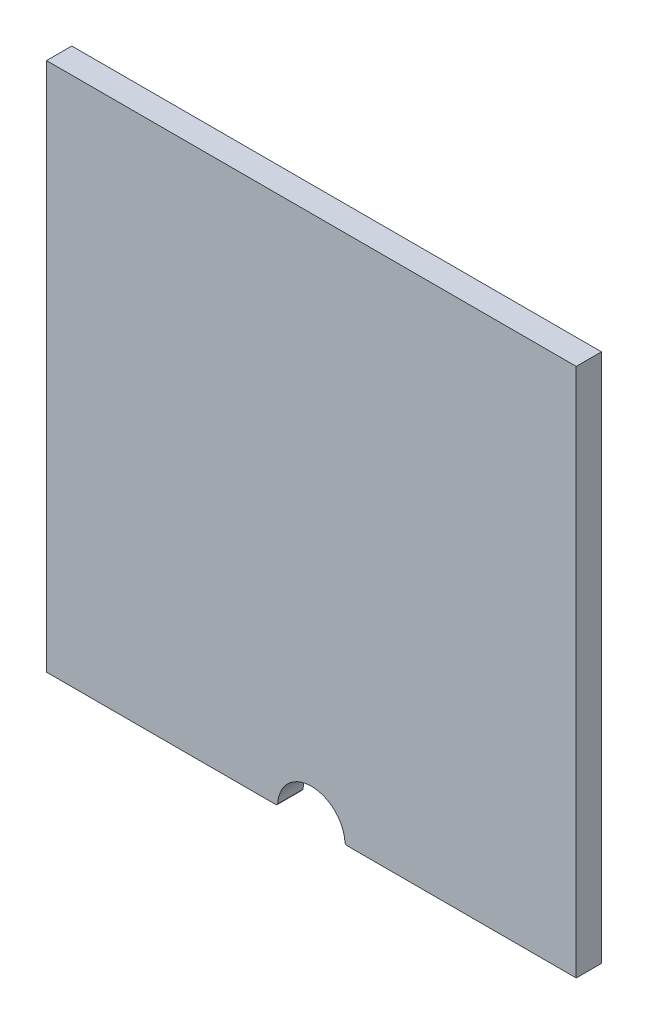
ISO-10303-21;
HEADER;
FILE_DESCRIPTION(('STEP AP214'),'2;1');
FILE_NAME('part.step','',(''),(''),'','','');
FILE_SCHEMA(('AUTOMOTIVE_DESIGN { 1 0 10303 214 1 1 1 1 }'));
ENDSEC;
DATA;
#1=APPLICATION_CONTEXT('core data for automotive mechanical design processes');
#2=APPLICATION_PROTOCOL_DEFINITION('international standard','automotive_design',2000,#1);
#3=PRODUCT_CONTEXT('',#1,'mechanical');
#4=PRODUCT('Part','Part','',(#3));
#5=PRODUCT_RELATED_PRODUCT_CATEGORY('part','',(#4));
#6=PRODUCT_DEFINITION_FORMATION('','',#4);
#7=PRODUCT_DEFINITION_CONTEXT('part definition',#1,'design');
#8=PRODUCT_DEFINITION('design','',#6,#7);
#9=PRODUCT_DEFINITION_SHAPE('','',#8);
#10=(LENGTH_UNIT() NAMED_UNIT(*) SI_UNIT(.MILLI.,.METRE.));
#11=(NAMED_UNIT(*) PLANE_ANGLE_UNIT() SI_UNIT($,.RADIAN.));
#12=(NAMED_UNIT(*) SI_UNIT($,.STERADIAN.) SOLID_ANGLE_UNIT());
#13=UNCERTAINTY_MEASURE_WITH_UNIT(LENGTH_MEASURE(1.E-05),#10,'distance_accuracy_value','');
#14=(GEOMETRIC_REPRESENTATION_CONTEXT(3) GLOBAL_UNCERTAINTY_ASSIGNED_CONTEXT((#13)) GLOBAL_UNIT_ASSIGNED_CONTEXT((#10,
#11,#12)) REPRESENTATION_CONTEXT('',''));
#15=CARTESIAN_POINT('',(0.,0.,0.));
#16=DIRECTION('',(0.,0.,1.));
#17=DIRECTION('',(1.,0.,0.));
#18=AXIS2_PLACEMENT_3D('',#15,#16,#17);
#19=CARTESIAN_POINT('',(0.0508,0.0508,0.));
#20=DIRECTION('',(0.,-1.,0.));
#21=DIRECTION('',(0.,0.,-1.));
#22=AXIS2_PLACEMENT_3D('',#19,#20,#21);
#23=PLANE('',#22);
#24=DIRECTION('',(1.,0.,0.));
#25=VECTOR('',#24,1.);
#26=CARTESIAN_POINT('',(0.0508,0.0508,9.525));
#27=LINE('',#26,#25);
#28=CARTESIAN_POINT('',(113.470384181604,0.0508,9.525));
#29=VERTEX_POINT('',#28);
#30=CARTESIAN_POINT('',(199.9492,0.0508,9.525));
#31=VERTEX_POINT('',#30);
#32=EDGE_CURVE('E146',#29,#31,#27,.T.);
#33=ORIENTED_EDGE('',*,*,#32,.F.);
#34=DIRECTION('',(0.,0.,-1.));
#35=VECTOR('',#34,1.);
#36=CARTESIAN_POINT('',(113.470384181604,0.0508,0.));
#37=LINE('',#36,#35);
#38=CARTESIAN_POINT('',(113.470384181604,0.0508,0.));
#39=VERTEX_POINT('',#38);
#40=EDGE_CURVE('E11',#29,#39,#37,.T.);
#41=ORIENTED_EDGE('',*,*,#40,.T.);
#42=DIRECTION('',(1.,0.,0.));
#43=VECTOR('',#42,1.);
#44=CARTESIAN_POINT('',(0.0508,0.0508,0.));
#45=LINE('',#44,#43);
#46=CARTESIAN_POINT('',(199.9492,0.0508,0.));
#47=VERTEX_POINT('',#46);
#48=EDGE_CURVE('E155',#39,#47,#45,.T.);
#49=ORIENTED_EDGE('',*,*,#48,.T.);
#50=DIRECTION('',(0.,0.,1.));
#51=VECTOR('',#50,1.);
#52=CARTESIAN_POINT('',(199.9492,0.0508,0.));
#53=LINE('',#52,#51);
#54=EDGE_CURVE('E134',#47,#31,#53,.T.);
#55=ORIENTED_EDGE('',*,*,#54,.T.);
#56=EDGE_LOOP('',(#33,#41,#49,#55));
#57=FACE_BOUND('',#56,.T.);
#58=ADVANCED_FACE('F39',(#57),#23,.T.);
#59=CARTESIAN_POINT('',(0.,0.,0.));
#60=DIRECTION('',(0.,0.,-1.));
#61=DIRECTION('',(-1.,0.,0.));
#62=AXIS2_PLACEMENT_3D('',#59,#60,#61);
#63=PLANE('',#62);
#64=CARTESIAN_POINT('',(100.,0.0508000000000002,0.));
#65=DIRECTION('',(0.,0.,1.));
#66=DIRECTION('',(1.,0.,0.));
#67=AXIS2_PLACEMENT_3D('',#64,#65,#66);
#68=CIRCLE('',#67,12.7);
#69=CARTESIAN_POINT('',(112.678008641509,0.797858823529412,0.));
#70=VERTEX_POINT('',#69);
#71=CARTESIAN_POINT('',(87.3219913584906,0.797858823529412,0.));
#72=VERTEX_POINT('',#71);
#73=EDGE_CURVE('E180',#70,#72,#68,.T.);
#74=ORIENTED_EDGE('',*,*,#73,.T.);
#75=CARTESIAN_POINT('',(86.5296158183963,0.84455,0.));
#76=DIRECTION('',(0.,0.,-1.));
#77=DIRECTION('',(-1.,0.,0.));
#78=AXIS2_PLACEMENT_3D('',#75,#76,#77);
#79=CIRCLE('',#78,0.79375);
#80=CARTESIAN_POINT('',(86.5296158183963,0.0508,0.));
#81=VERTEX_POINT('',#80);
#82=EDGE_CURVE('E48',#72,#81,#79,.T.);
#83=ORIENTED_EDGE('',*,*,#82,.T.);
#84=CARTESIAN_POINT('',(0.0508,0.0508,0.));
#85=VERTEX_POINT('',#84);
#86=EDGE_CURVE('E132',#85,#81,#45,.T.);
#87=ORIENTED_EDGE('',*,*,#86,.F.);
#88=DIRECTION('',(0.,-1.,0.));
#89=VECTOR('',#88,1.);
#90=CARTESIAN_POINT('',(0.0508,199.9492,0.));
#91=LINE('',#90,#89);
#92=CARTESIAN_POINT('',(0.0508,199.9492,0.));
#93=VERTEX_POINT('',#92);
#94=EDGE_CURVE('E110',#93,#85,#91,.T.);
#95=ORIENTED_EDGE('',*,*,#94,.F.);
#96=DIRECTION('',(-1.,0.,0.));
#97=VECTOR('',#96,1.);
#98=CARTESIAN_POINT('',(199.9492,199.9492,0.));
#99=LINE('',#98,#97);
#100=CARTESIAN_POINT('',(199.9492,199.9492,0.));
#101=VERTEX_POINT('',#100);
#102=EDGE_CURVE('E121',#101,#93,#99,.T.);
#103=ORIENTED_EDGE('',*,*,#102,.F.);
#104=DIRECTION('',(0.,1.,0.));
#105=VECTOR('',#104,1.);
#106=CARTESIAN_POINT('',(199.9492,0.0508,0.));
#107=LINE('',#106,#105);
#108=EDGE_CURVE('E128',#47,#101,#107,.T.);
#109=ORIENTED_EDGE('',*,*,#108,.F.);
#110=ORIENTED_EDGE('',*,*,#48,.F.);
#111=CARTESIAN_POINT('',(113.470384181604,0.84455,0.));
#112=DIRECTION('',(0.,0.,-1.));
#113=DIRECTION('',(-1.,0.,0.));
#114=AXIS2_PLACEMENT_3D('',#111,#112,#113);
#115=CIRCLE('',#114,0.79375);
#116=EDGE_CURVE('E176',#39,#70,#115,.T.);
#117=ORIENTED_EDGE('',*,*,#116,.T.);
#118=EDGE_LOOP('',(#74,#83,#87,#95,#103,#109,#110,#117));
#119=FACE_BOUND('',#118,.T.);
#120=ADVANCED_FACE('F130',(#119),#63,.T.);
#121=ORIENTED_EDGE('',*,*,#86,.T.);
#122=DIRECTION('',(0.,0.,-1.));
#123=VECTOR('',#122,1.);
#124=CARTESIAN_POINT('',(86.5296158183963,0.0508,9.525));
#125=LINE('',#124,#123);
#126=CARTESIAN_POINT('',(86.5296158183963,0.0508,9.525));
#127=VERTEX_POINT('',#126);
#128=EDGE_CURVE('E157',#81,#127,#125,.F.);
#129=ORIENTED_EDGE('',*,*,#128,.T.);
#130=CARTESIAN_POINT('',(0.0508,0.0508,9.525));
#131=VERTEX_POINT('',#130);
#132=EDGE_CURVE('E141',#131,#127,#27,.T.);
#133=ORIENTED_EDGE('',*,*,#132,.F.);
#134=DIRECTION('',(0.,0.,1.));
#135=VECTOR('',#134,1.);
#136=CARTESIAN_POINT('',(0.0508,0.0508,0.));
#137=LINE('',#136,#135);
#138=EDGE_CURVE('E117',#85,#131,#137,.T.);
#139=ORIENTED_EDGE('',*,*,#138,.F.);
#140=EDGE_LOOP('',(#121,#129,#133,#139));
#141=FACE_BOUND('',#140,.T.);
#142=ADVANCED_FACE('F184',(#141),#23,.T.);
#143=CARTESIAN_POINT('',(0.0508,199.9492,0.));
#144=DIRECTION('',(-1.,0.,0.));
#145=DIRECTION('',(0.,0.,1.));
#146=AXIS2_PLACEMENT_3D('',#143,#144,#145);
#147=PLANE('',#146);
#148=DIRECTION('',(0.,-1.,0.));
#149=VECTOR('',#148,1.);
#150=CARTESIAN_POINT('',(0.0508,199.9492,9.525));
#151=LINE('',#150,#149);
#152=CARTESIAN_POINT('',(0.0508,199.9492,9.525));
#153=VERTEX_POINT('',#152);
#154=EDGE_CURVE('E113',#153,#131,#151,.T.);
#155=ORIENTED_EDGE('',*,*,#154,.F.);
#156=DIRECTION('',(0.,0.,1.));
#157=VECTOR('',#156,1.);
#158=CARTESIAN_POINT('',(0.0508,199.9492,0.));
#159=LINE('',#158,#157);
#160=EDGE_CURVE('E106',#93,#153,#159,.T.);
#161=ORIENTED_EDGE('',*,*,#160,.F.);
#162=ORIENTED_EDGE('',*,*,#94,.T.);
#163=ORIENTED_EDGE('',*,*,#138,.T.);
#164=EDGE_LOOP('',(#155,#161,#162,#163));
#165=FACE_BOUND('',#164,.T.);
#166=ADVANCED_FACE('F108',(#165),#147,.T.);
#167=CARTESIAN_POINT('',(199.9492,199.9492,0.));
#168=DIRECTION('',(0.,1.,0.));
#169=DIRECTION('',(0.,0.,1.));
#170=AXIS2_PLACEMENT_3D('',#167,#168,#169);
#171=PLANE('',#170);
#172=DIRECTION('',(-1.,0.,0.));
#173=VECTOR('',#172,1.);
#174=CARTESIAN_POINT('',(199.9492,199.9492,9.525));
#175=LINE('',#174,#173);
#176=CARTESIAN_POINT('',(199.9492,199.9492,9.525));
#177=VERTEX_POINT('',#176);
#178=EDGE_CURVE('E150',#177,#153,#175,.T.);
#179=ORIENTED_EDGE('',*,*,#178,.F.);
#180=DIRECTION('',(0.,0.,1.));
#181=VECTOR('',#180,1.);
#182=CARTESIAN_POINT('',(199.9492,199.9492,0.));
#183=LINE('',#182,#181);
#184=EDGE_CURVE('E118',#101,#177,#183,.T.);
#185=ORIENTED_EDGE('',*,*,#184,.F.);
#186=ORIENTED_EDGE('',*,*,#102,.T.);
#187=ORIENTED_EDGE('',*,*,#160,.T.);
#188=EDGE_LOOP('',(#179,#185,#186,#187));
#189=FACE_BOUND('',#188,.T.);
#190=ADVANCED_FACE('F122',(#189),#171,.T.);
#191=CARTESIAN_POINT('',(199.9492,0.0508,0.));
#192=DIRECTION('',(1.,0.,0.));
#193=DIRECTION('',(0.,0.,-1.));
#194=AXIS2_PLACEMENT_3D('',#191,#192,#193);
#195=PLANE('',#194);
#196=DIRECTION('',(0.,1.,0.));
#197=VECTOR('',#196,1.);
#198=CARTESIAN_POINT('',(199.9492,0.0508,9.525));
#199=LINE('',#198,#197);
#200=EDGE_CURVE('E145',#31,#177,#199,.T.);
#201=ORIENTED_EDGE('',*,*,#200,.F.);
#202=ORIENTED_EDGE('',*,*,#54,.F.);
#203=ORIENTED_EDGE('',*,*,#108,.T.);
#204=ORIENTED_EDGE('',*,*,#184,.T.);
#205=EDGE_LOOP('',(#201,#202,#203,#204));
#206=FACE_BOUND('',#205,.T.);
#207=ADVANCED_FACE('F203',(#206),#195,.T.);
#208=CARTESIAN_POINT('',(0.,0.,9.525));
#209=DIRECTION('',(0.,0.,-1.));
#210=DIRECTION('',(-1.,0.,0.));
#211=AXIS2_PLACEMENT_3D('',#208,#209,#210);
#212=PLANE('',#211);
#213=ORIENTED_EDGE('',*,*,#132,.T.);
#214=CARTESIAN_POINT('',(86.5296158183963,0.84455,9.525));
#215=DIRECTION('',(0.,0.,-1.));
#216=DIRECTION('',(-1.,0.,0.));
#217=AXIS2_PLACEMENT_3D('',#214,#215,#216);
#218=CIRCLE('',#217,0.79375);
#219=CARTESIAN_POINT('',(87.3219913584906,0.797858823529412,9.525));
#220=VERTEX_POINT('',#219);
#221=EDGE_CURVE('E167',#127,#220,#218,.F.);
#222=ORIENTED_EDGE('',*,*,#221,.T.);
#223=CARTESIAN_POINT('',(100.,0.0508000000000002,9.525));
#224=DIRECTION('',(0.,0.,1.));
#225=DIRECTION('',(1.,0.,0.));
#226=AXIS2_PLACEMENT_3D('',#223,#224,#225);
#227=CIRCLE('',#226,12.7);
#228=CARTESIAN_POINT('',(112.678008641509,0.797858823529412,9.525));
#229=VERTEX_POINT('',#228);
#230=EDGE_CURVE('E192',#229,#220,#227,.T.);
#231=ORIENTED_EDGE('',*,*,#230,.F.);
#232=CARTESIAN_POINT('',(113.470384181604,0.84455,9.525));
#233=DIRECTION('',(0.,0.,-1.));
#234=DIRECTION('',(-1.,0.,0.));
#235=AXIS2_PLACEMENT_3D('',#232,#233,#234);
#236=CIRCLE('',#235,0.79375);
#237=EDGE_CURVE('E164',#229,#29,#236,.F.);
#238=ORIENTED_EDGE('',*,*,#237,.T.);
#239=ORIENTED_EDGE('',*,*,#32,.T.);
#240=ORIENTED_EDGE('',*,*,#200,.T.);
#241=ORIENTED_EDGE('',*,*,#178,.T.);
#242=ORIENTED_EDGE('',*,*,#154,.T.);
#243=EDGE_LOOP('',(#213,#222,#231,#238,#239,#240,#241,#242));
#244=FACE_BOUND('',#243,.T.);
#245=ADVANCED_FACE('F191',(#244),#212,.F.);
#246=CARTESIAN_POINT('',(100.,0.0508000000000002,0.));
#247=DIRECTION('',(0.,0.,1.));
#248=DIRECTION('',(1.,0.,0.));
#249=AXIS2_PLACEMENT_3D('',#246,#247,#248);
#250=CYLINDRICAL_SURFACE('',#249,12.7);
#251=ORIENTED_EDGE('',*,*,#230,.T.);
#252=DIRECTION('',(0.,0.,1.));
#253=VECTOR('',#252,1.);
#254=CARTESIAN_POINT('',(87.3219913584906,0.797858823529412,0.));
#255=LINE('',#254,#253);
#256=EDGE_CURVE('E61',#220,#72,#255,.F.);
#257=ORIENTED_EDGE('',*,*,#256,.T.);
#258=ORIENTED_EDGE('',*,*,#73,.F.);
#259=DIRECTION('',(0.,0.,1.));
#260=VECTOR('',#259,1.);
#261=CARTESIAN_POINT('',(112.678008641509,0.797858823529412,0.));
#262=LINE('',#261,#260);
#263=EDGE_CURVE('E170',#70,#229,#262,.T.);
#264=ORIENTED_EDGE('',*,*,#263,.T.);
#265=EDGE_LOOP('',(#251,#257,#258,#264));
#266=FACE_BOUND('',#265,.T.);
#267=ADVANCED_FACE('F193',(#266),#250,.F.);
#268=CARTESIAN_POINT('',(86.5296158183963,0.84455,0.));
#269=DIRECTION('',(0.,0.,1.));
#270=DIRECTION('',(1.,0.,0.));
#271=AXIS2_PLACEMENT_3D('',#268,#269,#270);
#272=CYLINDRICAL_SURFACE('',#271,0.79375);
#273=ORIENTED_EDGE('',*,*,#82,.F.);
#274=ORIENTED_EDGE('',*,*,#256,.F.);
#275=ORIENTED_EDGE('',*,*,#221,.F.);
#276=ORIENTED_EDGE('',*,*,#128,.F.);
#277=EDGE_LOOP('',(#273,#274,#275,#276));
#278=FACE_BOUND('',#277,.T.);
#279=ADVANCED_FACE('F188',(#278),#272,.T.);
#280=CARTESIAN_POINT('',(113.470384181604,0.84455,0.));
#281=DIRECTION('',(0.,0.,1.));
#282=DIRECTION('',(1.,0.,0.));
#283=AXIS2_PLACEMENT_3D('',#280,#281,#282);
#284=CYLINDRICAL_SURFACE('',#283,0.79375);
#285=ORIENTED_EDGE('',*,*,#116,.F.);
#286=ORIENTED_EDGE('',*,*,#40,.F.);
#287=ORIENTED_EDGE('',*,*,#237,.F.);
#288=ORIENTED_EDGE('',*,*,#263,.F.);
#289=EDGE_LOOP('',(#285,#286,#287,#288));
#290=FACE_BOUND('',#289,.T.);
#291=ADVANCED_FACE('F41',(#290),#284,.T.);
#292=CLOSED_SHELL('',(#58,#120,#142,#166,#190,#207,#245,#267,#279,#291));
#293=MANIFOLD_SOLID_BREP('B2',#292);
#294=ADVANCED_BREP_SHAPE_REPRESENTATION('',(#18,#293),#14);
#295=SHAPE_DEFINITION_REPRESENTATION(#9,#294);
ENDSEC;
END-ISO-10303-21;
